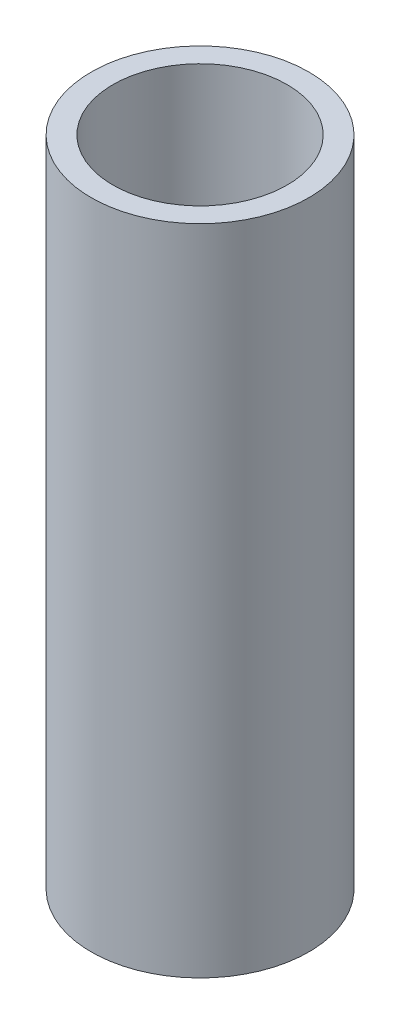
ISO-10303-21;
HEADER;
FILE_DESCRIPTION(('STEP AP214'),'2;1');
FILE_NAME('part.step','',(''),(''),'','','');
FILE_SCHEMA(('AUTOMOTIVE_DESIGN { 1 0 10303 214 1 1 1 1 }'));
ENDSEC;
DATA;
#1=APPLICATION_CONTEXT('core data for automotive mechanical design processes');
#2=APPLICATION_PROTOCOL_DEFINITION('international standard','automotive_design',2000,#1);
#3=PRODUCT_CONTEXT('',#1,'mechanical');
#4=PRODUCT('Part','Part','',(#3));
#5=PRODUCT_RELATED_PRODUCT_CATEGORY('part','',(#4));
#6=PRODUCT_DEFINITION_FORMATION('','',#4);
#7=PRODUCT_DEFINITION_CONTEXT('part definition',#1,'design');
#8=PRODUCT_DEFINITION('design','',#6,#7);
#9=PRODUCT_DEFINITION_SHAPE('','',#8);
#10=(LENGTH_UNIT() NAMED_UNIT(*) SI_UNIT(.MILLI.,.METRE.));
#11=(NAMED_UNIT(*) PLANE_ANGLE_UNIT() SI_UNIT($,.RADIAN.));
#12=(NAMED_UNIT(*) SI_UNIT($,.STERADIAN.) SOLID_ANGLE_UNIT());
#13=UNCERTAINTY_MEASURE_WITH_UNIT(LENGTH_MEASURE(1.E-05),#10,'distance_accuracy_value','');
#14=(GEOMETRIC_REPRESENTATION_CONTEXT(3) GLOBAL_UNCERTAINTY_ASSIGNED_CONTEXT((#13)) GLOBAL_UNIT_ASSIGNED_CONTEXT((#10,
#11,#12)) REPRESENTATION_CONTEXT('',''));
#15=CARTESIAN_POINT('',(0.,0.,0.));
#16=DIRECTION('',(0.,0.,1.));
#17=DIRECTION('',(1.,0.,0.));
#18=AXIS2_PLACEMENT_3D('',#15,#16,#17);
#19=CARTESIAN_POINT('',(0.,15.,0.));
#20=DIRECTION('',(0.,-1.,0.));
#21=DIRECTION('',(0.,0.,1.));
#22=AXIS2_PLACEMENT_3D('',#19,#20,#21);
#23=CYLINDRICAL_SURFACE('',#22,5.);
#24=CARTESIAN_POINT('',(0.,15.,0.));
#25=DIRECTION('',(0.,-1.,0.));
#26=DIRECTION('',(0.,0.,-1.));
#27=AXIS2_PLACEMENT_3D('',#24,#25,#26);
#28=CIRCLE('',#27,5.);
#29=CARTESIAN_POINT('',(0.,15.,-5.));
#30=VERTEX_POINT('',#29);
#31=EDGE_CURVE('E10',#30,#30,#28,.T.);
#32=ORIENTED_EDGE('',*,*,#31,.T.);
#33=EDGE_LOOP('',(#32));
#34=FACE_BOUND('',#33,.T.);
#35=CARTESIAN_POINT('',(0.,-15.,0.));
#36=DIRECTION('',(0.,-1.,0.));
#37=DIRECTION('',(0.,0.,-1.));
#38=AXIS2_PLACEMENT_3D('',#35,#36,#37);
#39=CIRCLE('',#38,5.);
#40=CARTESIAN_POINT('',(0.,-15.,-5.));
#41=VERTEX_POINT('',#40);
#42=EDGE_CURVE('E38',#41,#41,#39,.T.);
#43=ORIENTED_EDGE('',*,*,#42,.F.);
#44=EDGE_LOOP('',(#43));
#45=FACE_BOUND('',#44,.T.);
#46=ADVANCED_FACE('F35',(#34,#45),#23,.T.);
#47=CARTESIAN_POINT('',(0.,15.,0.));
#48=DIRECTION('',(0.,1.,0.));
#49=DIRECTION('',(0.,0.,-1.));
#50=AXIS2_PLACEMENT_3D('',#47,#48,#49);
#51=PLANE('',#50);
#52=CARTESIAN_POINT('',(0.,15.,0.));
#53=DIRECTION('',(0.,-1.,0.));
#54=DIRECTION('',(0.,0.,-1.));
#55=AXIS2_PLACEMENT_3D('',#52,#53,#54);
#56=CIRCLE('',#55,4.);
#57=CARTESIAN_POINT('',(0.,15.,-4.));
#58=VERTEX_POINT('',#57);
#59=EDGE_CURVE('E45',#58,#58,#56,.T.);
#60=ORIENTED_EDGE('',*,*,#59,.T.);
#61=EDGE_LOOP('',(#60));
#62=FACE_BOUND('',#61,.T.);
#63=ORIENTED_EDGE('',*,*,#31,.F.);
#64=EDGE_LOOP('',(#63));
#65=FACE_BOUND('',#64,.T.);
#66=ADVANCED_FACE('F58',(#62,#65),#51,.T.);
#67=CARTESIAN_POINT('',(0.,-15.,0.));
#68=DIRECTION('',(0.,1.,0.));
#69=DIRECTION('',(0.,0.,-1.));
#70=AXIS2_PLACEMENT_3D('',#67,#68,#69);
#71=PLANE('',#70);
#72=CARTESIAN_POINT('',(0.,-15.,0.));
#73=DIRECTION('',(0.,-1.,0.));
#74=DIRECTION('',(0.,0.,-1.));
#75=AXIS2_PLACEMENT_3D('',#72,#73,#74);
#76=CIRCLE('',#75,4.);
#77=CARTESIAN_POINT('',(0.,-15.,-4.));
#78=VERTEX_POINT('',#77);
#79=EDGE_CURVE('E49',#78,#78,#76,.T.);
#80=ORIENTED_EDGE('',*,*,#79,.F.);
#81=EDGE_LOOP('',(#80));
#82=FACE_BOUND('',#81,.T.);
#83=ORIENTED_EDGE('',*,*,#42,.T.);
#84=EDGE_LOOP('',(#83));
#85=FACE_BOUND('',#84,.T.);
#86=ADVANCED_FACE('F55',(#82,#85),#71,.F.);
#87=CARTESIAN_POINT('',(0.,15.,0.));
#88=DIRECTION('',(0.,-1.,0.));
#89=DIRECTION('',(0.,0.,1.));
#90=AXIS2_PLACEMENT_3D('',#87,#88,#89);
#91=CYLINDRICAL_SURFACE('',#90,4.);
#92=ORIENTED_EDGE('',*,*,#59,.F.);
#93=EDGE_LOOP('',(#92));
#94=FACE_BOUND('',#93,.T.);
#95=ORIENTED_EDGE('',*,*,#79,.T.);
#96=EDGE_LOOP('',(#95));
#97=FACE_BOUND('',#96,.T.);
#98=ADVANCED_FACE('F53',(#94,#97),#91,.F.);
#99=CLOSED_SHELL('',(#46,#66,#86,#98));
#100=MANIFOLD_SOLID_BREP('B2',#99);
#101=ADVANCED_BREP_SHAPE_REPRESENTATION('',(#18,#100),#14);
#102=SHAPE_DEFINITION_REPRESENTATION(#9,#101);
ENDSEC;
END-ISO-10303-21;
